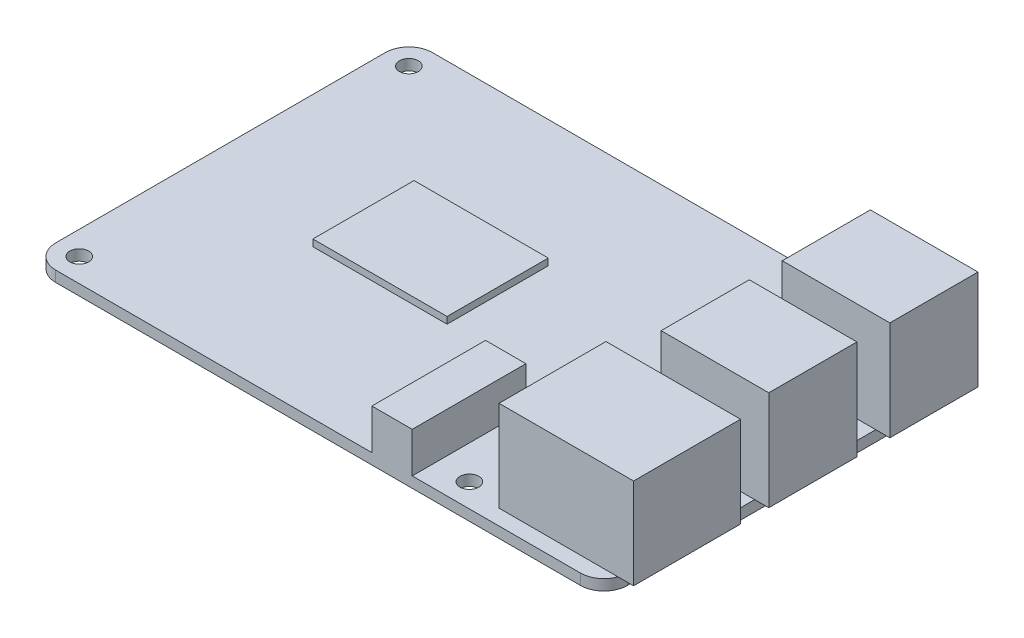
ISO-10303-21;
HEADER;
FILE_DESCRIPTION(('STEP AP214'),'2;1');
FILE_NAME('part.step','',(''),(''),'','','');
FILE_SCHEMA(('AUTOMOTIVE_DESIGN { 1 0 10303 214 1 1 1 1 }'));
ENDSEC;
DATA;
#1=APPLICATION_CONTEXT('core data for automotive mechanical design processes');
#2=APPLICATION_PROTOCOL_DEFINITION('international standard','automotive_design',2000,#1);
#3=PRODUCT_CONTEXT('',#1,'mechanical');
#4=PRODUCT('Part','Part','',(#3));
#5=PRODUCT_RELATED_PRODUCT_CATEGORY('part','',(#4));
#6=PRODUCT_DEFINITION_FORMATION('','',#4);
#7=PRODUCT_DEFINITION_CONTEXT('part definition',#1,'design');
#8=PRODUCT_DEFINITION('design','',#6,#7);
#9=PRODUCT_DEFINITION_SHAPE('','',#8);
#10=(LENGTH_UNIT() NAMED_UNIT(*) SI_UNIT(.MILLI.,.METRE.));
#11=(NAMED_UNIT(*) PLANE_ANGLE_UNIT() SI_UNIT($,.RADIAN.));
#12=(NAMED_UNIT(*) SI_UNIT($,.STERADIAN.) SOLID_ANGLE_UNIT());
#13=UNCERTAINTY_MEASURE_WITH_UNIT(LENGTH_MEASURE(1.E-05),#10,'distance_accuracy_value','');
#14=(GEOMETRIC_REPRESENTATION_CONTEXT(3) GLOBAL_UNCERTAINTY_ASSIGNED_CONTEXT((#13)) GLOBAL_UNIT_ASSIGNED_CONTEXT((#10,
#11,#12)) REPRESENTATION_CONTEXT('',''));
#15=CARTESIAN_POINT('',(0.,0.,0.));
#16=DIRECTION('',(0.,0.,1.));
#17=DIRECTION('',(1.,0.,0.));
#18=AXIS2_PLACEMENT_3D('',#15,#16,#17);
#19=CARTESIAN_POINT('',(39.,1.6,-24.5));
#20=DIRECTION('',(0.,-1.,0.));
#21=DIRECTION('',(0.,0.,-1.));
#22=AXIS2_PLACEMENT_3D('',#19,#20,#21);
#23=PLANE('',#22);
#24=DIRECTION('',(0.,0.,1.));
#25=VECTOR('',#24,1.);
#26=CARTESIAN_POINT('',(8.00000000000001,1.6,11.1));
#27=LINE('',#26,#25);
#28=CARTESIAN_POINT('',(8.00000000000001,1.6,11.1));
#29=VERTEX_POINT('',#28);
#30=CARTESIAN_POINT('',(8.00000000000001,1.6,28.));
#31=VERTEX_POINT('',#30);
#32=EDGE_CURVE('E259',#29,#31,#27,.T.);
#33=ORIENTED_EDGE('',*,*,#32,.F.);
#34=DIRECTION('',(-1.,0.,0.));
#35=VECTOR('',#34,1.);
#36=CARTESIAN_POINT('',(8.00000000000001,1.6,11.1));
#37=LINE('',#36,#35);
#38=CARTESIAN_POINT('',(14.,1.6,11.1));
#39=VERTEX_POINT('',#38);
#40=EDGE_CURVE('E272',#39,#29,#37,.T.);
#41=ORIENTED_EDGE('',*,*,#40,.F.);
#42=DIRECTION('',(0.,0.,-1.));
#43=VECTOR('',#42,1.);
#44=CARTESIAN_POINT('',(14.,1.6,11.1));
#45=LINE('',#44,#43);
#46=CARTESIAN_POINT('',(14.,1.6,28.));
#47=VERTEX_POINT('',#46);
#48=EDGE_CURVE('E262',#47,#39,#45,.T.);
#49=ORIENTED_EDGE('',*,*,#48,.F.);
#50=DIRECTION('',(1.,0.,0.));
#51=VECTOR('',#50,1.);
#52=CARTESIAN_POINT('',(-39.,1.6,28.));
#53=LINE('',#52,#51);
#54=CARTESIAN_POINT('',(39.,1.6,28.));
#55=VERTEX_POINT('',#54);
#56=EDGE_CURVE('E430',#47,#55,#53,.T.);
#57=ORIENTED_EDGE('',*,*,#56,.T.);
#58=CARTESIAN_POINT('',(39.,1.6,24.5));
#59=DIRECTION('',(0.,1.,0.));
#60=DIRECTION('',(0.,0.,-1.));
#61=AXIS2_PLACEMENT_3D('',#58,#59,#60);
#62=CIRCLE('',#61,3.5);
#63=CARTESIAN_POINT('',(42.2878564445547,1.6,25.7));
#64=VERTEX_POINT('',#63);
#65=EDGE_CURVE('E434',#55,#64,#62,.T.);
#66=ORIENTED_EDGE('',*,*,#65,.T.);
#67=DIRECTION('',(1.,0.,0.));
#68=VECTOR('',#67,1.);
#69=CARTESIAN_POINT('',(24.6,1.6,25.7));
#70=LINE('',#69,#68);
#71=CARTESIAN_POINT('',(24.6,1.6,25.7));
#72=VERTEX_POINT('',#71);
#73=EDGE_CURVE('E376',#72,#64,#70,.T.);
#74=ORIENTED_EDGE('',*,*,#73,.F.);
#75=DIRECTION('',(0.,0.,1.));
#76=VECTOR('',#75,1.);
#77=CARTESIAN_POINT('',(24.6,1.6,9.8));
#78=LINE('',#77,#76);
#79=CARTESIAN_POINT('',(24.6,1.6,9.8));
#80=VERTEX_POINT('',#79);
#81=EDGE_CURVE('E362',#80,#72,#78,.T.);
#82=ORIENTED_EDGE('',*,*,#81,.F.);
#83=DIRECTION('',(-1.,0.,0.));
#84=VECTOR('',#83,1.);
#85=CARTESIAN_POINT('',(24.6,1.6,9.8));
#86=LINE('',#85,#84);
#87=CARTESIAN_POINT('',(42.5,1.6,9.8));
#88=VERTEX_POINT('',#87);
#89=EDGE_CURVE('E11',#88,#80,#86,.T.);
#90=ORIENTED_EDGE('',*,*,#89,.F.);
#91=DIRECTION('',(0.,0.,-1.));
#92=VECTOR('',#91,1.);
#93=CARTESIAN_POINT('',(42.5,1.6,-24.5));
#94=LINE('',#93,#92);
#95=CARTESIAN_POINT('',(42.5,1.6,5.6));
#96=VERTEX_POINT('',#95);
#97=EDGE_CURVE('E441',#88,#96,#94,.T.);
#98=ORIENTED_EDGE('',*,*,#97,.T.);
#99=DIRECTION('',(1.,0.,0.));
#100=VECTOR('',#99,1.);
#101=CARTESIAN_POINT('',(28.6,1.6,5.6));
#102=LINE('',#101,#100);
#103=CARTESIAN_POINT('',(28.6,1.6,5.6));
#104=VERTEX_POINT('',#103);
#105=EDGE_CURVE('E343',#104,#96,#102,.T.);
#106=ORIENTED_EDGE('',*,*,#105,.F.);
#107=DIRECTION('',(0.,0.,1.));
#108=VECTOR('',#107,1.);
#109=CARTESIAN_POINT('',(28.6,1.6,-7.5));
#110=LINE('',#109,#108);
#111=CARTESIAN_POINT('',(28.6,1.6,-7.5));
#112=VERTEX_POINT('',#111);
#113=EDGE_CURVE('E328',#112,#104,#110,.T.);
#114=ORIENTED_EDGE('',*,*,#113,.F.);
#115=DIRECTION('',(-1.,0.,0.));
#116=VECTOR('',#115,1.);
#117=CARTESIAN_POINT('',(28.6,1.6,-7.5));
#118=LINE('',#117,#116);
#119=CARTESIAN_POINT('',(42.5,1.6,-7.5));
#120=VERTEX_POINT('',#119);
#121=EDGE_CURVE('E348',#120,#112,#118,.T.);
#122=ORIENTED_EDGE('',*,*,#121,.F.);
#123=CARTESIAN_POINT('',(42.5,1.6,-12.4));
#124=VERTEX_POINT('',#123);
#125=EDGE_CURVE('E527',#120,#124,#94,.T.);
#126=ORIENTED_EDGE('',*,*,#125,.T.);
#127=DIRECTION('',(1.,0.,0.));
#128=VECTOR('',#127,1.);
#129=CARTESIAN_POINT('',(28.6,1.6,-12.4));
#130=LINE('',#129,#128);
#131=CARTESIAN_POINT('',(28.6,1.6,-12.4));
#132=VERTEX_POINT('',#131);
#133=EDGE_CURVE('E309',#132,#124,#130,.T.);
#134=ORIENTED_EDGE('',*,*,#133,.F.);
#135=DIRECTION('',(0.,0.,1.));
#136=VECTOR('',#135,1.);
#137=CARTESIAN_POINT('',(28.6,1.6,-25.5));
#138=LINE('',#137,#136);
#139=CARTESIAN_POINT('',(28.6,1.6,-25.5));
#140=VERTEX_POINT('',#139);
#141=EDGE_CURVE('E294',#140,#132,#138,.T.);
#142=ORIENTED_EDGE('',*,*,#141,.F.);
#143=DIRECTION('',(-1.,0.,0.));
#144=VECTOR('',#143,1.);
#145=CARTESIAN_POINT('',(28.6,1.6,-25.5));
#146=LINE('',#145,#144);
#147=CARTESIAN_POINT('',(42.3541019662497,1.6,-25.5));
#148=VERTEX_POINT('',#147);
#149=EDGE_CURVE('E314',#148,#140,#146,.T.);
#150=ORIENTED_EDGE('',*,*,#149,.F.);
#151=CARTESIAN_POINT('',(39.,1.6,-24.5));
#152=DIRECTION('',(0.,1.,0.));
#153=DIRECTION('',(0.,0.,-1.));
#154=AXIS2_PLACEMENT_3D('',#151,#152,#153);
#155=CIRCLE('',#154,3.5);
#156=CARTESIAN_POINT('',(39.,1.6,-28.));
#157=VERTEX_POINT('',#156);
#158=EDGE_CURVE('E422',#148,#157,#155,.T.);
#159=ORIENTED_EDGE('',*,*,#158,.T.);
#160=DIRECTION('',(-1.,0.,0.));
#161=VECTOR('',#160,1.);
#162=CARTESIAN_POINT('',(-39.,1.6,-28.));
#163=LINE('',#162,#161);
#164=CARTESIAN_POINT('',(-39.,1.6,-28.));
#165=VERTEX_POINT('',#164);
#166=EDGE_CURVE('E421',#157,#165,#163,.T.);
#167=ORIENTED_EDGE('',*,*,#166,.T.);
#168=CARTESIAN_POINT('',(-39.,1.6,-24.5));
#169=DIRECTION('',(0.,1.,0.));
#170=DIRECTION('',(0.,0.,-1.));
#171=AXIS2_PLACEMENT_3D('',#168,#169,#170);
#172=CIRCLE('',#171,3.5);
#173=CARTESIAN_POINT('',(-42.5,1.6,-24.5));
#174=VERTEX_POINT('',#173);
#175=EDGE_CURVE('E424',#165,#174,#172,.T.);
#176=ORIENTED_EDGE('',*,*,#175,.T.);
#177=DIRECTION('',(0.,0.,1.));
#178=VECTOR('',#177,1.);
#179=CARTESIAN_POINT('',(-42.5,1.6,-24.5));
#180=LINE('',#179,#178);
#181=CARTESIAN_POINT('',(-42.5,1.6,24.5));
#182=VERTEX_POINT('',#181);
#183=EDGE_CURVE('E426',#174,#182,#180,.T.);
#184=ORIENTED_EDGE('',*,*,#183,.T.);
#185=CARTESIAN_POINT('',(-39.,1.6,24.5));
#186=DIRECTION('',(0.,1.,0.));
#187=DIRECTION('',(0.,0.,-1.));
#188=AXIS2_PLACEMENT_3D('',#185,#186,#187);
#189=CIRCLE('',#188,3.5);
#190=CARTESIAN_POINT('',(-39.,1.6,28.));
#191=VERTEX_POINT('',#190);
#192=EDGE_CURVE('E428',#182,#191,#189,.T.);
#193=ORIENTED_EDGE('',*,*,#192,.T.);
#194=EDGE_CURVE('E431',#191,#31,#53,.T.);
#195=ORIENTED_EDGE('',*,*,#194,.T.);
#196=EDGE_LOOP('',(#33,#41,#49,#57,#66,#74,#82,#90,#98,#106,#114,#122,#126,#134,#142,#150,#159,
#167,#176,#184,#193,#195));
#197=FACE_BOUND('',#196,.T.);
#198=CARTESIAN_POINT('',(-39.,1.6,24.5));
#199=DIRECTION('',(0.,1.,0.));
#200=DIRECTION('',(0.,0.,-1.));
#201=AXIS2_PLACEMENT_3D('',#198,#199,#200);
#202=CIRCLE('',#201,1.4);
#203=CARTESIAN_POINT('',(-39.,1.6,23.1));
#204=VERTEX_POINT('',#203);
#205=EDGE_CURVE('E394',#204,#204,#202,.T.);
#206=ORIENTED_EDGE('',*,*,#205,.F.);
#207=EDGE_LOOP('',(#206));
#208=FACE_BOUND('',#207,.T.);
#209=CARTESIAN_POINT('',(19.,1.6,-24.5));
#210=DIRECTION('',(0.,1.,0.));
#211=DIRECTION('',(0.,0.,1.));
#212=AXIS2_PLACEMENT_3D('',#209,#210,#211);
#213=CIRCLE('',#212,1.4);
#214=CARTESIAN_POINT('',(19.,1.6,-23.1));
#215=VERTEX_POINT('',#214);
#216=EDGE_CURVE('E406',#215,#215,#213,.T.);
#217=ORIENTED_EDGE('',*,*,#216,.F.);
#218=EDGE_LOOP('',(#217));
#219=FACE_BOUND('',#218,.T.);
#220=CARTESIAN_POINT('',(-39.,1.6,-24.5));
#221=DIRECTION('',(0.,1.,0.));
#222=DIRECTION('',(0.,0.,1.));
#223=AXIS2_PLACEMENT_3D('',#220,#221,#222);
#224=CIRCLE('',#223,1.4);
#225=CARTESIAN_POINT('',(-39.,1.6,-23.1));
#226=VERTEX_POINT('',#225);
#227=EDGE_CURVE('E412',#226,#226,#224,.T.);
#228=ORIENTED_EDGE('',*,*,#227,.F.);
#229=EDGE_LOOP('',(#228));
#230=FACE_BOUND('',#229,.T.);
#231=CARTESIAN_POINT('',(19.,1.6,24.5));
#232=DIRECTION('',(0.,1.,0.));
#233=DIRECTION('',(0.,0.,-1.));
#234=AXIS2_PLACEMENT_3D('',#231,#232,#233);
#235=CIRCLE('',#234,1.4);
#236=CARTESIAN_POINT('',(19.,1.6,23.1));
#237=VERTEX_POINT('',#236);
#238=EDGE_CURVE('E400',#237,#237,#235,.T.);
#239=ORIENTED_EDGE('',*,*,#238,.F.);
#240=EDGE_LOOP('',(#239));
#241=FACE_BOUND('',#240,.T.);
#242=DIRECTION('',(0.,0.,1.));
#243=VECTOR('',#242,1.);
#244=CARTESIAN_POINT('',(-22.8863754940238,1.6,-9.15515216544926));
#245=LINE('',#244,#243);
#246=CARTESIAN_POINT('',(-22.8863754940238,1.6,-9.15515216544926));
#247=VERTEX_POINT('',#246);
#248=CARTESIAN_POINT('',(-22.8863754940238,1.6,5.88180167054008));
#249=VERTEX_POINT('',#248);
#250=EDGE_CURVE('E258',#247,#249,#245,.T.);
#251=ORIENTED_EDGE('',*,*,#250,.F.);
#252=DIRECTION('',(-1.,0.,0.));
#253=VECTOR('',#252,1.);
#254=CARTESIAN_POINT('',(-22.8863754940238,1.6,-9.15515216544926));
#255=LINE('',#254,#253);
#256=CARTESIAN_POINT('',(-2.93939591567062,1.6,-9.15515216544926));
#257=VERTEX_POINT('',#256);
#258=EDGE_CURVE('E255',#257,#247,#255,.T.);
#259=ORIENTED_EDGE('',*,*,#258,.F.);
#260=DIRECTION('',(0.,0.,-1.));
#261=VECTOR('',#260,1.);
#262=CARTESIAN_POINT('',(-2.93939591567062,1.6,-9.15515216544926));
#263=LINE('',#262,#261);
#264=CARTESIAN_POINT('',(-2.93939591567062,1.6,5.88180167054008));
#265=VERTEX_POINT('',#264);
#266=EDGE_CURVE('E55',#265,#257,#263,.T.);
#267=ORIENTED_EDGE('',*,*,#266,.F.);
#268=DIRECTION('',(1.,0.,0.));
#269=VECTOR('',#268,1.);
#270=CARTESIAN_POINT('',(-22.8863754940238,1.6,5.88180167054009));
#271=LINE('',#270,#269);
#272=EDGE_CURVE('E50',#249,#265,#271,.T.);
#273=ORIENTED_EDGE('',*,*,#272,.F.);
#274=EDGE_LOOP('',(#251,#259,#267,#273));
#275=FACE_BOUND('',#274,.T.);
#276=ADVANCED_FACE('F33',(#197,#208,#219,#230,#241,#275),#23,.F.);
#277=CARTESIAN_POINT('',(39.,0.,-24.5));
#278=DIRECTION('',(0.,-1.,0.));
#279=DIRECTION('',(0.,0.,-1.));
#280=AXIS2_PLACEMENT_3D('',#277,#278,#279);
#281=PLANE('',#280);
#282=CARTESIAN_POINT('',(19.,0.,24.5));
#283=DIRECTION('',(0.,1.,0.));
#284=DIRECTION('',(0.,0.,-1.));
#285=AXIS2_PLACEMENT_3D('',#282,#283,#284);
#286=CIRCLE('',#285,1.4);
#287=CARTESIAN_POINT('',(19.,0.,23.1));
#288=VERTEX_POINT('',#287);
#289=EDGE_CURVE('E397',#288,#288,#286,.T.);
#290=ORIENTED_EDGE('',*,*,#289,.T.);
#291=EDGE_LOOP('',(#290));
#292=FACE_BOUND('',#291,.T.);
#293=CARTESIAN_POINT('',(-39.,0.,-24.5));
#294=DIRECTION('',(0.,1.,0.));
#295=DIRECTION('',(0.,0.,1.));
#296=AXIS2_PLACEMENT_3D('',#293,#294,#295);
#297=CIRCLE('',#296,1.4);
#298=CARTESIAN_POINT('',(-39.,0.,-23.1));
#299=VERTEX_POINT('',#298);
#300=EDGE_CURVE('E409',#299,#299,#297,.T.);
#301=ORIENTED_EDGE('',*,*,#300,.T.);
#302=EDGE_LOOP('',(#301));
#303=FACE_BOUND('',#302,.T.);
#304=CARTESIAN_POINT('',(39.,0.,-24.5));
#305=DIRECTION('',(0.,1.,0.));
#306=DIRECTION('',(0.,0.,-1.));
#307=AXIS2_PLACEMENT_3D('',#304,#305,#306);
#308=CIRCLE('',#307,3.5);
#309=CARTESIAN_POINT('',(42.5,0.,-24.5));
#310=VERTEX_POINT('',#309);
#311=CARTESIAN_POINT('',(39.,0.,-28.));
#312=VERTEX_POINT('',#311);
#313=EDGE_CURVE('E415',#310,#312,#308,.T.);
#314=ORIENTED_EDGE('',*,*,#313,.F.);
#315=DIRECTION('',(0.,0.,-1.));
#316=VECTOR('',#315,1.);
#317=CARTESIAN_POINT('',(42.5,0.,-24.5));
#318=LINE('',#317,#316);
#319=CARTESIAN_POINT('',(42.5,0.,24.5));
#320=VERTEX_POINT('',#319);
#321=EDGE_CURVE('E456',#320,#310,#318,.T.);
#322=ORIENTED_EDGE('',*,*,#321,.F.);
#323=CARTESIAN_POINT('',(39.,0.,24.5));
#324=DIRECTION('',(0.,1.,0.));
#325=DIRECTION('',(0.,0.,-1.));
#326=AXIS2_PLACEMENT_3D('',#323,#324,#325);
#327=CIRCLE('',#326,3.5);
#328=CARTESIAN_POINT('',(39.,0.,28.));
#329=VERTEX_POINT('',#328);
#330=EDGE_CURVE('E454',#329,#320,#327,.T.);
#331=ORIENTED_EDGE('',*,*,#330,.F.);
#332=DIRECTION('',(1.,0.,0.));
#333=VECTOR('',#332,1.);
#334=CARTESIAN_POINT('',(-39.,0.,28.));
#335=LINE('',#334,#333);
#336=CARTESIAN_POINT('',(-39.,0.,28.));
#337=VERTEX_POINT('',#336);
#338=EDGE_CURVE('E452',#337,#329,#335,.T.);
#339=ORIENTED_EDGE('',*,*,#338,.F.);
#340=CARTESIAN_POINT('',(-39.,0.,24.5));
#341=DIRECTION('',(0.,1.,0.));
#342=DIRECTION('',(0.,0.,-1.));
#343=AXIS2_PLACEMENT_3D('',#340,#341,#342);
#344=CIRCLE('',#343,3.5);
#345=CARTESIAN_POINT('',(-42.5,0.,24.5));
#346=VERTEX_POINT('',#345);
#347=EDGE_CURVE('E450',#346,#337,#344,.T.);
#348=ORIENTED_EDGE('',*,*,#347,.F.);
#349=DIRECTION('',(0.,0.,1.));
#350=VECTOR('',#349,1.);
#351=CARTESIAN_POINT('',(-42.5,0.,-24.5));
#352=LINE('',#351,#350);
#353=CARTESIAN_POINT('',(-42.5,0.,-24.5));
#354=VERTEX_POINT('',#353);
#355=EDGE_CURVE('E448',#354,#346,#352,.T.);
#356=ORIENTED_EDGE('',*,*,#355,.F.);
#357=CARTESIAN_POINT('',(-39.,0.,-24.5));
#358=DIRECTION('',(0.,1.,0.));
#359=DIRECTION('',(0.,0.,-1.));
#360=AXIS2_PLACEMENT_3D('',#357,#358,#359);
#361=CIRCLE('',#360,3.5);
#362=CARTESIAN_POINT('',(-39.,0.,-28.));
#363=VERTEX_POINT('',#362);
#364=EDGE_CURVE('E446',#363,#354,#361,.T.);
#365=ORIENTED_EDGE('',*,*,#364,.F.);
#366=DIRECTION('',(-1.,0.,0.));
#367=VECTOR('',#366,1.);
#368=CARTESIAN_POINT('',(-39.,0.,-28.));
#369=LINE('',#368,#367);
#370=EDGE_CURVE('E444',#312,#363,#369,.T.);
#371=ORIENTED_EDGE('',*,*,#370,.F.);
#372=EDGE_LOOP('',(#314,#322,#331,#339,#348,#356,#365,#371));
#373=FACE_BOUND('',#372,.T.);
#374=CARTESIAN_POINT('',(19.,0.,-24.5));
#375=DIRECTION('',(0.,1.,0.));
#376=DIRECTION('',(0.,0.,1.));
#377=AXIS2_PLACEMENT_3D('',#374,#375,#376);
#378=CIRCLE('',#377,1.4);
#379=CARTESIAN_POINT('',(19.,0.,-23.1));
#380=VERTEX_POINT('',#379);
#381=EDGE_CURVE('E403',#380,#380,#378,.T.);
#382=ORIENTED_EDGE('',*,*,#381,.T.);
#383=EDGE_LOOP('',(#382));
#384=FACE_BOUND('',#383,.T.);
#385=CARTESIAN_POINT('',(-39.,0.,24.5));
#386=DIRECTION('',(0.,1.,0.));
#387=DIRECTION('',(0.,0.,-1.));
#388=AXIS2_PLACEMENT_3D('',#385,#386,#387);
#389=CIRCLE('',#388,1.4);
#390=CARTESIAN_POINT('',(-39.,0.,23.1));
#391=VERTEX_POINT('',#390);
#392=EDGE_CURVE('E393',#391,#391,#389,.T.);
#393=ORIENTED_EDGE('',*,*,#392,.T.);
#394=EDGE_LOOP('',(#393));
#395=FACE_BOUND('',#394,.T.);
#396=ADVANCED_FACE('F491',(#292,#303,#373,#384,#395),#281,.T.);
#397=CARTESIAN_POINT('',(39.,1.6,-24.5));
#398=DIRECTION('',(0.,-1.,0.));
#399=DIRECTION('',(0.,0.,-1.));
#400=AXIS2_PLACEMENT_3D('',#397,#398,#399);
#401=CYLINDRICAL_SURFACE('',#400,3.5);
#402=ORIENTED_EDGE('',*,*,#313,.T.);
#403=DIRECTION('',(0.,-1.,0.));
#404=VECTOR('',#403,1.);
#405=CARTESIAN_POINT('',(39.,1.6,-28.));
#406=LINE('',#405,#404);
#407=EDGE_CURVE('E37',#157,#312,#406,.T.);
#408=ORIENTED_EDGE('',*,*,#407,.F.);
#409=ORIENTED_EDGE('',*,*,#158,.F.);
#410=CARTESIAN_POINT('',(42.5,1.6,-24.5));
#411=VERTEX_POINT('',#410);
#412=EDGE_CURVE('E418',#411,#148,#155,.T.);
#413=ORIENTED_EDGE('',*,*,#412,.F.);
#414=DIRECTION('',(0.,-1.,0.));
#415=VECTOR('',#414,1.);
#416=CARTESIAN_POINT('',(42.5,1.6,-24.5));
#417=LINE('',#416,#415);
#418=EDGE_CURVE('E440',#411,#310,#417,.T.);
#419=ORIENTED_EDGE('',*,*,#418,.T.);
#420=EDGE_LOOP('',(#402,#408,#409,#413,#419));
#421=FACE_BOUND('',#420,.T.);
#422=ADVANCED_FACE('F35',(#421),#401,.T.);
#423=CARTESIAN_POINT('',(-39.,1.6,-28.));
#424=DIRECTION('',(0.,0.,1.));
#425=DIRECTION('',(1.,0.,0.));
#426=AXIS2_PLACEMENT_3D('',#423,#424,#425);
#427=PLANE('',#426);
#428=ORIENTED_EDGE('',*,*,#370,.T.);
#429=DIRECTION('',(0.,-1.,0.));
#430=VECTOR('',#429,1.);
#431=CARTESIAN_POINT('',(-39.,1.6,-28.));
#432=LINE('',#431,#430);
#433=EDGE_CURVE('E474',#165,#363,#432,.T.);
#434=ORIENTED_EDGE('',*,*,#433,.F.);
#435=ORIENTED_EDGE('',*,*,#166,.F.);
#436=ORIENTED_EDGE('',*,*,#407,.T.);
#437=EDGE_LOOP('',(#428,#434,#435,#436));
#438=FACE_BOUND('',#437,.T.);
#439=ADVANCED_FACE('F484',(#438),#427,.F.);
#440=CARTESIAN_POINT('',(-39.,1.6,-24.5));
#441=DIRECTION('',(0.,-1.,0.));
#442=DIRECTION('',(0.,0.,-1.));
#443=AXIS2_PLACEMENT_3D('',#440,#441,#442);
#444=CYLINDRICAL_SURFACE('',#443,3.5);
#445=ORIENTED_EDGE('',*,*,#364,.T.);
#446=DIRECTION('',(0.,-1.,0.));
#447=VECTOR('',#446,1.);
#448=CARTESIAN_POINT('',(-42.5,1.6,-24.5));
#449=LINE('',#448,#447);
#450=EDGE_CURVE('E472',#174,#354,#449,.T.);
#451=ORIENTED_EDGE('',*,*,#450,.F.);
#452=ORIENTED_EDGE('',*,*,#175,.F.);
#453=ORIENTED_EDGE('',*,*,#433,.T.);
#454=EDGE_LOOP('',(#445,#451,#452,#453));
#455=FACE_BOUND('',#454,.T.);
#456=ADVANCED_FACE('F497',(#455),#444,.T.);
#457=CARTESIAN_POINT('',(-42.5,1.6,-24.5));
#458=DIRECTION('',(1.,0.,0.));
#459=DIRECTION('',(0.,0.,-1.));
#460=AXIS2_PLACEMENT_3D('',#457,#458,#459);
#461=PLANE('',#460);
#462=ORIENTED_EDGE('',*,*,#355,.T.);
#463=DIRECTION('',(0.,-1.,0.));
#464=VECTOR('',#463,1.);
#465=CARTESIAN_POINT('',(-42.5,1.6,24.5));
#466=LINE('',#465,#464);
#467=EDGE_CURVE('E469',#182,#346,#466,.T.);
#468=ORIENTED_EDGE('',*,*,#467,.F.);
#469=ORIENTED_EDGE('',*,*,#183,.F.);
#470=ORIENTED_EDGE('',*,*,#450,.T.);
#471=EDGE_LOOP('',(#462,#468,#469,#470));
#472=FACE_BOUND('',#471,.T.);
#473=ADVANCED_FACE('F500',(#472),#461,.F.);
#474=CARTESIAN_POINT('',(-39.,1.6,24.5));
#475=DIRECTION('',(0.,-1.,0.));
#476=DIRECTION('',(0.,0.,-1.));
#477=AXIS2_PLACEMENT_3D('',#474,#475,#476);
#478=CYLINDRICAL_SURFACE('',#477,3.5);
#479=ORIENTED_EDGE('',*,*,#347,.T.);
#480=DIRECTION('',(0.,-1.,0.));
#481=VECTOR('',#480,1.);
#482=CARTESIAN_POINT('',(-39.,1.6,28.));
#483=LINE('',#482,#481);
#484=EDGE_CURVE('E466',#191,#337,#483,.T.);
#485=ORIENTED_EDGE('',*,*,#484,.F.);
#486=ORIENTED_EDGE('',*,*,#192,.F.);
#487=ORIENTED_EDGE('',*,*,#467,.T.);
#488=EDGE_LOOP('',(#479,#485,#486,#487));
#489=FACE_BOUND('',#488,.T.);
#490=ADVANCED_FACE('F591',(#489),#478,.T.);
#491=CARTESIAN_POINT('',(-39.,1.6,28.));
#492=DIRECTION('',(0.,0.,-1.));
#493=DIRECTION('',(-1.,0.,0.));
#494=AXIS2_PLACEMENT_3D('',#491,#492,#493);
#495=PLANE('',#494);
#496=ORIENTED_EDGE('',*,*,#338,.T.);
#497=DIRECTION('',(0.,-1.,0.));
#498=VECTOR('',#497,1.);
#499=CARTESIAN_POINT('',(39.,1.6,28.));
#500=LINE('',#499,#498);
#501=EDGE_CURVE('E463',#55,#329,#500,.T.);
#502=ORIENTED_EDGE('',*,*,#501,.F.);
#503=ORIENTED_EDGE('',*,*,#56,.F.);
#504=DIRECTION('',(0.,-1.,0.));
#505=VECTOR('',#504,1.);
#506=CARTESIAN_POINT('',(14.,7.6,28.));
#507=LINE('',#506,#505);
#508=CARTESIAN_POINT('',(14.,7.6,28.));
#509=VERTEX_POINT('',#508);
#510=EDGE_CURVE('E288',#509,#47,#507,.T.);
#511=ORIENTED_EDGE('',*,*,#510,.F.);
#512=DIRECTION('',(1.,0.,0.));
#513=VECTOR('',#512,1.);
#514=CARTESIAN_POINT('',(8.00000000000001,7.6,28.));
#515=LINE('',#514,#513);
#516=CARTESIAN_POINT('',(8.00000000000001,7.6,28.));
#517=VERTEX_POINT('',#516);
#518=EDGE_CURVE('E271',#517,#509,#515,.T.);
#519=ORIENTED_EDGE('',*,*,#518,.F.);
#520=DIRECTION('',(0.,-1.,0.));
#521=VECTOR('',#520,1.);
#522=CARTESIAN_POINT('',(8.00000000000001,7.6,28.));
#523=LINE('',#522,#521);
#524=EDGE_CURVE('E291',#517,#31,#523,.T.);
#525=ORIENTED_EDGE('',*,*,#524,.T.);
#526=ORIENTED_EDGE('',*,*,#194,.F.);
#527=ORIENTED_EDGE('',*,*,#484,.T.);
#528=EDGE_LOOP('',(#496,#502,#503,#511,#519,#525,#526,#527));
#529=FACE_BOUND('',#528,.T.);
#530=ADVANCED_FACE('F587',(#529),#495,.F.);
#531=CARTESIAN_POINT('',(39.,1.6,24.5));
#532=DIRECTION('',(0.,-1.,0.));
#533=DIRECTION('',(0.,0.,-1.));
#534=AXIS2_PLACEMENT_3D('',#531,#532,#533);
#535=CYLINDRICAL_SURFACE('',#534,3.5);
#536=ORIENTED_EDGE('',*,*,#330,.T.);
#537=DIRECTION('',(0.,-1.,0.));
#538=VECTOR('',#537,1.);
#539=CARTESIAN_POINT('',(42.5,1.6,24.5));
#540=LINE('',#539,#538);
#541=CARTESIAN_POINT('',(42.5,1.6,24.5));
#542=VERTEX_POINT('',#541);
#543=EDGE_CURVE('E460',#542,#320,#540,.T.);
#544=ORIENTED_EDGE('',*,*,#543,.F.);
#545=EDGE_CURVE('E433',#64,#542,#62,.T.);
#546=ORIENTED_EDGE('',*,*,#545,.F.);
#547=ORIENTED_EDGE('',*,*,#65,.F.);
#548=ORIENTED_EDGE('',*,*,#501,.T.);
#549=EDGE_LOOP('',(#536,#544,#546,#547,#548));
#550=FACE_BOUND('',#549,.T.);
#551=ADVANCED_FACE('F584',(#550),#535,.T.);
#552=CARTESIAN_POINT('',(42.5,1.6,-24.5));
#553=DIRECTION('',(-1.,0.,0.));
#554=DIRECTION('',(0.,0.,1.));
#555=AXIS2_PLACEMENT_3D('',#552,#553,#554);
#556=PLANE('',#555);
#557=ORIENTED_EDGE('',*,*,#321,.T.);
#558=ORIENTED_EDGE('',*,*,#418,.F.);
#559=EDGE_CURVE('E436',#124,#411,#94,.T.);
#560=ORIENTED_EDGE('',*,*,#559,.F.);
#561=ORIENTED_EDGE('',*,*,#125,.F.);
#562=EDGE_CURVE('E531',#96,#120,#94,.T.);
#563=ORIENTED_EDGE('',*,*,#562,.F.);
#564=ORIENTED_EDGE('',*,*,#97,.F.);
#565=EDGE_CURVE('E437',#542,#88,#94,.T.);
#566=ORIENTED_EDGE('',*,*,#565,.F.);
#567=ORIENTED_EDGE('',*,*,#543,.T.);
#568=EDGE_LOOP('',(#557,#558,#560,#561,#563,#564,#566,#567));
#569=FACE_BOUND('',#568,.T.);
#570=ADVANCED_FACE('F581',(#569),#556,.F.);
#571=CARTESIAN_POINT('',(-39.,1.6,-24.5));
#572=DIRECTION('',(0.,-1.,0.));
#573=DIRECTION('',(0.,0.,-1.));
#574=AXIS2_PLACEMENT_3D('',#571,#572,#573);
#575=CYLINDRICAL_SURFACE('',#574,1.4);
#576=ORIENTED_EDGE('',*,*,#227,.T.);
#577=EDGE_LOOP('',(#576));
#578=FACE_BOUND('',#577,.T.);
#579=ORIENTED_EDGE('',*,*,#300,.F.);
#580=EDGE_LOOP('',(#579));
#581=FACE_BOUND('',#580,.T.);
#582=ADVANCED_FACE('F578',(#578,#581),#575,.F.);
#583=CARTESIAN_POINT('',(19.,1.6,-24.5));
#584=DIRECTION('',(0.,-1.,0.));
#585=DIRECTION('',(0.,0.,-1.));
#586=AXIS2_PLACEMENT_3D('',#583,#584,#585);
#587=CYLINDRICAL_SURFACE('',#586,1.4);
#588=ORIENTED_EDGE('',*,*,#216,.T.);
#589=EDGE_LOOP('',(#588));
#590=FACE_BOUND('',#589,.T.);
#591=ORIENTED_EDGE('',*,*,#381,.F.);
#592=EDGE_LOOP('',(#591));
#593=FACE_BOUND('',#592,.T.);
#594=ADVANCED_FACE('F866',(#590,#593),#587,.F.);
#595=CARTESIAN_POINT('',(19.,1.6,24.5));
#596=DIRECTION('',(0.,-1.,0.));
#597=DIRECTION('',(0.,0.,-1.));
#598=AXIS2_PLACEMENT_3D('',#595,#596,#597);
#599=CYLINDRICAL_SURFACE('',#598,1.4);
#600=ORIENTED_EDGE('',*,*,#238,.T.);
#601=EDGE_LOOP('',(#600));
#602=FACE_BOUND('',#601,.T.);
#603=ORIENTED_EDGE('',*,*,#289,.F.);
#604=EDGE_LOOP('',(#603));
#605=FACE_BOUND('',#604,.T.);
#606=ADVANCED_FACE('F863',(#602,#605),#599,.F.);
#607=CARTESIAN_POINT('',(-39.,1.6,24.5));
#608=DIRECTION('',(0.,-1.,0.));
#609=DIRECTION('',(0.,0.,-1.));
#610=AXIS2_PLACEMENT_3D('',#607,#608,#609);
#611=CYLINDRICAL_SURFACE('',#610,1.4);
#612=ORIENTED_EDGE('',*,*,#205,.T.);
#613=EDGE_LOOP('',(#612));
#614=FACE_BOUND('',#613,.T.);
#615=ORIENTED_EDGE('',*,*,#392,.F.);
#616=EDGE_LOOP('',(#615));
#617=FACE_BOUND('',#616,.T.);
#618=ADVANCED_FACE('F861',(#614,#617),#611,.F.);
#619=CARTESIAN_POINT('',(0.,1.6,0.));
#620=DIRECTION('',(0.,1.,0.));
#621=DIRECTION('',(0.,0.,1.));
#622=AXIS2_PLACEMENT_3D('',#619,#620,#621);
#623=PLANE('',#622);
#624=CARTESIAN_POINT('',(44.6,1.6,25.7));
#625=VERTEX_POINT('',#624);
#626=EDGE_CURVE('E375',#64,#625,#70,.T.);
#627=ORIENTED_EDGE('',*,*,#626,.F.);
#628=ORIENTED_EDGE('',*,*,#545,.T.);
#629=ORIENTED_EDGE('',*,*,#565,.T.);
#630=CARTESIAN_POINT('',(44.6,1.6,9.8));
#631=VERTEX_POINT('',#630);
#632=EDGE_CURVE('E43',#631,#88,#86,.T.);
#633=ORIENTED_EDGE('',*,*,#632,.F.);
#634=DIRECTION('',(0.,0.,-1.));
#635=VECTOR('',#634,1.);
#636=CARTESIAN_POINT('',(44.6,1.6,9.8));
#637=LINE('',#636,#635);
#638=EDGE_CURVE('E379',#625,#631,#637,.T.);
#639=ORIENTED_EDGE('',*,*,#638,.F.);
#640=EDGE_LOOP('',(#627,#628,#629,#633,#639));
#641=FACE_BOUND('',#640,.T.);
#642=ADVANCED_FACE('F831',(#641),#623,.F.);
#643=CARTESIAN_POINT('',(24.6,15.1,9.8));
#644=DIRECTION('',(1.,0.,0.));
#645=DIRECTION('',(0.,0.,-1.));
#646=AXIS2_PLACEMENT_3D('',#643,#644,#645);
#647=PLANE('',#646);
#648=ORIENTED_EDGE('',*,*,#81,.T.);
#649=DIRECTION('',(0.,-1.,0.));
#650=VECTOR('',#649,1.);
#651=CARTESIAN_POINT('',(24.6,15.1,25.7));
#652=LINE('',#651,#650);
#653=CARTESIAN_POINT('',(24.6,15.1,25.7));
#654=VERTEX_POINT('',#653);
#655=EDGE_CURVE('E390',#654,#72,#652,.T.);
#656=ORIENTED_EDGE('',*,*,#655,.F.);
#657=DIRECTION('',(0.,0.,1.));
#658=VECTOR('',#657,1.);
#659=CARTESIAN_POINT('',(24.6,15.1,9.8));
#660=LINE('',#659,#658);
#661=CARTESIAN_POINT('',(24.6,15.1,9.8));
#662=VERTEX_POINT('',#661);
#663=EDGE_CURVE('E363',#662,#654,#660,.T.);
#664=ORIENTED_EDGE('',*,*,#663,.F.);
#665=DIRECTION('',(0.,-1.,0.));
#666=VECTOR('',#665,1.);
#667=CARTESIAN_POINT('',(24.6,15.1,9.8));
#668=LINE('',#667,#666);
#669=EDGE_CURVE('E372',#662,#80,#668,.T.);
#670=ORIENTED_EDGE('',*,*,#669,.T.);
#671=EDGE_LOOP('',(#648,#656,#664,#670));
#672=FACE_BOUND('',#671,.T.);
#673=ADVANCED_FACE('F843',(#672),#647,.F.);
#674=CARTESIAN_POINT('',(24.6,15.1,25.7));
#675=DIRECTION('',(0.,0.,-1.));
#676=DIRECTION('',(-1.,0.,0.));
#677=AXIS2_PLACEMENT_3D('',#674,#675,#676);
#678=PLANE('',#677);
#679=ORIENTED_EDGE('',*,*,#73,.T.);
#680=ORIENTED_EDGE('',*,*,#626,.T.);
#681=DIRECTION('',(0.,-1.,0.));
#682=VECTOR('',#681,1.);
#683=CARTESIAN_POINT('',(44.6,15.1,25.7));
#684=LINE('',#683,#682);
#685=CARTESIAN_POINT('',(44.6,15.1,25.7));
#686=VERTEX_POINT('',#685);
#687=EDGE_CURVE('E387',#686,#625,#684,.T.);
#688=ORIENTED_EDGE('',*,*,#687,.F.);
#689=DIRECTION('',(1.,0.,0.));
#690=VECTOR('',#689,1.);
#691=CARTESIAN_POINT('',(24.6,15.1,25.7));
#692=LINE('',#691,#690);
#693=EDGE_CURVE('E366',#654,#686,#692,.T.);
#694=ORIENTED_EDGE('',*,*,#693,.F.);
#695=ORIENTED_EDGE('',*,*,#655,.T.);
#696=EDGE_LOOP('',(#679,#680,#688,#694,#695));
#697=FACE_BOUND('',#696,.T.);
#698=ADVANCED_FACE('F835',(#697),#678,.F.);
#699=CARTESIAN_POINT('',(44.6,15.1,9.8));
#700=DIRECTION('',(-1.,0.,0.));
#701=DIRECTION('',(0.,0.,1.));
#702=AXIS2_PLACEMENT_3D('',#699,#700,#701);
#703=PLANE('',#702);
#704=ORIENTED_EDGE('',*,*,#638,.T.);
#705=DIRECTION('',(0.,-1.,0.));
#706=VECTOR('',#705,1.);
#707=CARTESIAN_POINT('',(44.6,15.1,9.8));
#708=LINE('',#707,#706);
#709=CARTESIAN_POINT('',(44.6,15.1,9.8));
#710=VERTEX_POINT('',#709);
#711=EDGE_CURVE('E384',#710,#631,#708,.T.);
#712=ORIENTED_EDGE('',*,*,#711,.F.);
#713=DIRECTION('',(0.,0.,-1.));
#714=VECTOR('',#713,1.);
#715=CARTESIAN_POINT('',(44.6,15.1,9.8));
#716=LINE('',#715,#714);
#717=EDGE_CURVE('E368',#686,#710,#716,.T.);
#718=ORIENTED_EDGE('',*,*,#717,.F.);
#719=ORIENTED_EDGE('',*,*,#687,.T.);
#720=EDGE_LOOP('',(#704,#712,#718,#719));
#721=FACE_BOUND('',#720,.T.);
#722=ADVANCED_FACE('F848',(#721),#703,.F.);
#723=CARTESIAN_POINT('',(24.6,15.1,9.8));
#724=DIRECTION('',(0.,0.,1.));
#725=DIRECTION('',(1.,0.,0.));
#726=AXIS2_PLACEMENT_3D('',#723,#724,#725);
#727=PLANE('',#726);
#728=ORIENTED_EDGE('',*,*,#632,.T.);
#729=ORIENTED_EDGE('',*,*,#89,.T.);
#730=ORIENTED_EDGE('',*,*,#669,.F.);
#731=DIRECTION('',(-1.,0.,0.));
#732=VECTOR('',#731,1.);
#733=CARTESIAN_POINT('',(24.6,15.1,9.8));
#734=LINE('',#733,#732);
#735=EDGE_CURVE('E370',#710,#662,#734,.T.);
#736=ORIENTED_EDGE('',*,*,#735,.F.);
#737=ORIENTED_EDGE('',*,*,#711,.T.);
#738=EDGE_LOOP('',(#728,#729,#730,#736,#737));
#739=FACE_BOUND('',#738,.T.);
#740=ADVANCED_FACE('F840',(#739),#727,.F.);
#741=CARTESIAN_POINT('',(0.,15.1,0.));
#742=DIRECTION('',(0.,1.,0.));
#743=DIRECTION('',(0.,0.,1.));
#744=AXIS2_PLACEMENT_3D('',#741,#742,#743);
#745=PLANE('',#744);
#746=ORIENTED_EDGE('',*,*,#663,.T.);
#747=ORIENTED_EDGE('',*,*,#693,.T.);
#748=ORIENTED_EDGE('',*,*,#717,.T.);
#749=ORIENTED_EDGE('',*,*,#735,.T.);
#750=EDGE_LOOP('',(#746,#747,#748,#749));
#751=FACE_BOUND('',#750,.T.);
#752=ADVANCED_FACE('F608',(#751),#745,.T.);
#753=CARTESIAN_POINT('',(0.,1.6,0.));
#754=DIRECTION('',(0.,1.,0.));
#755=DIRECTION('',(0.,0.,1.));
#756=AXIS2_PLACEMENT_3D('',#753,#754,#755);
#757=PLANE('',#756);
#758=CARTESIAN_POINT('',(44.6,1.6,5.6));
#759=VERTEX_POINT('',#758);
#760=EDGE_CURVE('E342',#96,#759,#102,.T.);
#761=ORIENTED_EDGE('',*,*,#760,.F.);
#762=ORIENTED_EDGE('',*,*,#562,.T.);
#763=CARTESIAN_POINT('',(44.6,1.6,-7.5));
#764=VERTEX_POINT('',#763);
#765=EDGE_CURVE('E333',#764,#120,#118,.T.);
#766=ORIENTED_EDGE('',*,*,#765,.F.);
#767=DIRECTION('',(0.,0.,-1.));
#768=VECTOR('',#767,1.);
#769=CARTESIAN_POINT('',(44.6,1.6,-7.5));
#770=LINE('',#769,#768);
#771=EDGE_CURVE('E346',#759,#764,#770,.T.);
#772=ORIENTED_EDGE('',*,*,#771,.F.);
#773=EDGE_LOOP('',(#761,#762,#766,#772));
#774=FACE_BOUND('',#773,.T.);
#775=ADVANCED_FACE('F539',(#774),#757,.F.);
#776=CARTESIAN_POINT('',(28.6,16.4,-7.5));
#777=DIRECTION('',(1.,0.,0.));
#778=DIRECTION('',(0.,0.,-1.));
#779=AXIS2_PLACEMENT_3D('',#776,#777,#778);
#780=PLANE('',#779);
#781=ORIENTED_EDGE('',*,*,#113,.T.);
#782=DIRECTION('',(0.,-1.,0.));
#783=VECTOR('',#782,1.);
#784=CARTESIAN_POINT('',(28.6,16.4,5.6));
#785=LINE('',#784,#783);
#786=CARTESIAN_POINT('',(28.6,16.4,5.6));
#787=VERTEX_POINT('',#786);
#788=EDGE_CURVE('E359',#787,#104,#785,.T.);
#789=ORIENTED_EDGE('',*,*,#788,.F.);
#790=DIRECTION('',(0.,0.,1.));
#791=VECTOR('',#790,1.);
#792=CARTESIAN_POINT('',(28.6,16.4,-7.5));
#793=LINE('',#792,#791);
#794=CARTESIAN_POINT('',(28.6,16.4,-7.5));
#795=VERTEX_POINT('',#794);
#796=EDGE_CURVE('E329',#795,#787,#793,.T.);
#797=ORIENTED_EDGE('',*,*,#796,.F.);
#798=DIRECTION('',(0.,-1.,0.));
#799=VECTOR('',#798,1.);
#800=CARTESIAN_POINT('',(28.6,16.4,-7.5));
#801=LINE('',#800,#799);
#802=EDGE_CURVE('E339',#795,#112,#801,.T.);
#803=ORIENTED_EDGE('',*,*,#802,.T.);
#804=EDGE_LOOP('',(#781,#789,#797,#803));
#805=FACE_BOUND('',#804,.T.);
#806=ADVANCED_FACE('F546',(#805),#780,.F.);
#807=CARTESIAN_POINT('',(28.6,16.4,5.6));
#808=DIRECTION('',(0.,0.,-1.));
#809=DIRECTION('',(-1.,0.,0.));
#810=AXIS2_PLACEMENT_3D('',#807,#808,#809);
#811=PLANE('',#810);
#812=ORIENTED_EDGE('',*,*,#105,.T.);
#813=ORIENTED_EDGE('',*,*,#760,.T.);
#814=DIRECTION('',(0.,-1.,0.));
#815=VECTOR('',#814,1.);
#816=CARTESIAN_POINT('',(44.6,16.4,5.6));
#817=LINE('',#816,#815);
#818=CARTESIAN_POINT('',(44.6,16.4,5.6));
#819=VERTEX_POINT('',#818);
#820=EDGE_CURVE('E356',#819,#759,#817,.T.);
#821=ORIENTED_EDGE('',*,*,#820,.F.);
#822=DIRECTION('',(1.,0.,0.));
#823=VECTOR('',#822,1.);
#824=CARTESIAN_POINT('',(28.6,16.4,5.6));
#825=LINE('',#824,#823);
#826=EDGE_CURVE('E332',#787,#819,#825,.T.);
#827=ORIENTED_EDGE('',*,*,#826,.F.);
#828=ORIENTED_EDGE('',*,*,#788,.T.);
#829=EDGE_LOOP('',(#812,#813,#821,#827,#828));
#830=FACE_BOUND('',#829,.T.);
#831=ADVANCED_FACE('F542',(#830),#811,.F.);
#832=CARTESIAN_POINT('',(44.6,16.4,-7.5));
#833=DIRECTION('',(-1.,0.,0.));
#834=DIRECTION('',(0.,0.,1.));
#835=AXIS2_PLACEMENT_3D('',#832,#833,#834);
#836=PLANE('',#835);
#837=ORIENTED_EDGE('',*,*,#771,.T.);
#838=DIRECTION('',(0.,-1.,0.));
#839=VECTOR('',#838,1.);
#840=CARTESIAN_POINT('',(44.6,16.4,-7.5));
#841=LINE('',#840,#839);
#842=CARTESIAN_POINT('',(44.6,16.4,-7.5));
#843=VERTEX_POINT('',#842);
#844=EDGE_CURVE('E353',#843,#764,#841,.T.);
#845=ORIENTED_EDGE('',*,*,#844,.F.);
#846=DIRECTION('',(0.,0.,-1.));
#847=VECTOR('',#846,1.);
#848=CARTESIAN_POINT('',(44.6,16.4,-7.5));
#849=LINE('',#848,#847);
#850=EDGE_CURVE('E335',#819,#843,#849,.T.);
#851=ORIENTED_EDGE('',*,*,#850,.F.);
#852=ORIENTED_EDGE('',*,*,#820,.T.);
#853=EDGE_LOOP('',(#837,#845,#851,#852));
#854=FACE_BOUND('',#853,.T.);
#855=ADVANCED_FACE('F554',(#854),#836,.F.);
#856=CARTESIAN_POINT('',(28.6,16.4,-7.5));
#857=DIRECTION('',(0.,0.,1.));
#858=DIRECTION('',(1.,0.,0.));
#859=AXIS2_PLACEMENT_3D('',#856,#857,#858);
#860=PLANE('',#859);
#861=ORIENTED_EDGE('',*,*,#765,.T.);
#862=ORIENTED_EDGE('',*,*,#121,.T.);
#863=ORIENTED_EDGE('',*,*,#802,.F.);
#864=DIRECTION('',(-1.,0.,0.));
#865=VECTOR('',#864,1.);
#866=CARTESIAN_POINT('',(28.6,16.4,-7.5));
#867=LINE('',#866,#865);
#868=EDGE_CURVE('E337',#843,#795,#867,.T.);
#869=ORIENTED_EDGE('',*,*,#868,.F.);
#870=ORIENTED_EDGE('',*,*,#844,.T.);
#871=EDGE_LOOP('',(#861,#862,#863,#869,#870));
#872=FACE_BOUND('',#871,.T.);
#873=ADVANCED_FACE('F549',(#872),#860,.F.);
#874=CARTESIAN_POINT('',(0.,16.4,0.));
#875=DIRECTION('',(0.,1.,0.));
#876=DIRECTION('',(0.,0.,1.));
#877=AXIS2_PLACEMENT_3D('',#874,#875,#876);
#878=PLANE('',#877);
#879=ORIENTED_EDGE('',*,*,#796,.T.);
#880=ORIENTED_EDGE('',*,*,#826,.T.);
#881=ORIENTED_EDGE('',*,*,#850,.T.);
#882=ORIENTED_EDGE('',*,*,#868,.T.);
#883=EDGE_LOOP('',(#879,#880,#881,#882));
#884=FACE_BOUND('',#883,.T.);
#885=ADVANCED_FACE('F556',(#884),#878,.T.);
#886=CARTESIAN_POINT('',(0.,1.6,0.));
#887=DIRECTION('',(0.,1.,0.));
#888=DIRECTION('',(0.,0.,1.));
#889=AXIS2_PLACEMENT_3D('',#886,#887,#888);
#890=PLANE('',#889);
#891=ORIENTED_EDGE('',*,*,#559,.T.);
#892=ORIENTED_EDGE('',*,*,#412,.T.);
#893=CARTESIAN_POINT('',(44.6,1.6,-25.5));
#894=VERTEX_POINT('',#893);
#895=EDGE_CURVE('E299',#894,#148,#146,.T.);
#896=ORIENTED_EDGE('',*,*,#895,.F.);
#897=DIRECTION('',(0.,0.,-1.));
#898=VECTOR('',#897,1.);
#899=CARTESIAN_POINT('',(44.6,1.6,-25.5));
#900=LINE('',#899,#898);
#901=CARTESIAN_POINT('',(44.6,1.6,-12.4));
#902=VERTEX_POINT('',#901);
#903=EDGE_CURVE('E312',#902,#894,#900,.T.);
#904=ORIENTED_EDGE('',*,*,#903,.F.);
#905=EDGE_CURVE('E308',#124,#902,#130,.T.);
#906=ORIENTED_EDGE('',*,*,#905,.F.);
#907=EDGE_LOOP('',(#891,#892,#896,#904,#906));
#908=FACE_BOUND('',#907,.T.);
#909=ADVANCED_FACE('F510',(#908),#890,.F.);
#910=CARTESIAN_POINT('',(28.6,16.4,-25.5));
#911=DIRECTION('',(1.,0.,0.));
#912=DIRECTION('',(0.,0.,-1.));
#913=AXIS2_PLACEMENT_3D('',#910,#911,#912);
#914=PLANE('',#913);
#915=ORIENTED_EDGE('',*,*,#141,.T.);
#916=DIRECTION('',(0.,-1.,0.));
#917=VECTOR('',#916,1.);
#918=CARTESIAN_POINT('',(28.6,16.4,-12.4));
#919=LINE('',#918,#917);
#920=CARTESIAN_POINT('',(28.6,16.4,-12.4));
#921=VERTEX_POINT('',#920);
#922=EDGE_CURVE('E325',#921,#132,#919,.T.);
#923=ORIENTED_EDGE('',*,*,#922,.F.);
#924=DIRECTION('',(0.,0.,1.));
#925=VECTOR('',#924,1.);
#926=CARTESIAN_POINT('',(28.6,16.4,-25.5));
#927=LINE('',#926,#925);
#928=CARTESIAN_POINT('',(28.6,16.4,-25.5));
#929=VERTEX_POINT('',#928);
#930=EDGE_CURVE('E295',#929,#921,#927,.T.);
#931=ORIENTED_EDGE('',*,*,#930,.F.);
#932=DIRECTION('',(0.,-1.,0.));
#933=VECTOR('',#932,1.);
#934=CARTESIAN_POINT('',(28.6,16.4,-25.5));
#935=LINE('',#934,#933);
#936=EDGE_CURVE('E305',#929,#140,#935,.T.);
#937=ORIENTED_EDGE('',*,*,#936,.T.);
#938=EDGE_LOOP('',(#915,#923,#931,#937));
#939=FACE_BOUND('',#938,.T.);
#940=ADVANCED_FACE('F563',(#939),#914,.F.);
#941=CARTESIAN_POINT('',(28.6,16.4,-12.4));
#942=DIRECTION('',(0.,0.,-1.));
#943=DIRECTION('',(-1.,0.,0.));
#944=AXIS2_PLACEMENT_3D('',#941,#942,#943);
#945=PLANE('',#944);
#946=ORIENTED_EDGE('',*,*,#133,.T.);
#947=ORIENTED_EDGE('',*,*,#905,.T.);
#948=DIRECTION('',(0.,-1.,0.));
#949=VECTOR('',#948,1.);
#950=CARTESIAN_POINT('',(44.6,16.4,-12.4));
#951=LINE('',#950,#949);
#952=CARTESIAN_POINT('',(44.6,16.4,-12.4));
#953=VERTEX_POINT('',#952);
#954=EDGE_CURVE('E322',#953,#902,#951,.T.);
#955=ORIENTED_EDGE('',*,*,#954,.F.);
#956=DIRECTION('',(1.,0.,0.));
#957=VECTOR('',#956,1.);
#958=CARTESIAN_POINT('',(28.6,16.4,-12.4));
#959=LINE('',#958,#957);
#960=EDGE_CURVE('E298',#921,#953,#959,.T.);
#961=ORIENTED_EDGE('',*,*,#960,.F.);
#962=ORIENTED_EDGE('',*,*,#922,.T.);
#963=EDGE_LOOP('',(#946,#947,#955,#961,#962));
#964=FACE_BOUND('',#963,.T.);
#965=ADVANCED_FACE('F523',(#964),#945,.F.);
#966=CARTESIAN_POINT('',(44.6,16.4,-25.5));
#967=DIRECTION('',(-1.,0.,0.));
#968=DIRECTION('',(0.,0.,1.));
#969=AXIS2_PLACEMENT_3D('',#966,#967,#968);
#970=PLANE('',#969);
#971=ORIENTED_EDGE('',*,*,#903,.T.);
#972=DIRECTION('',(0.,-1.,0.));
#973=VECTOR('',#972,1.);
#974=CARTESIAN_POINT('',(44.6,16.4,-25.5));
#975=LINE('',#974,#973);
#976=CARTESIAN_POINT('',(44.6,16.4,-25.5));
#977=VERTEX_POINT('',#976);
#978=EDGE_CURVE('E319',#977,#894,#975,.T.);
#979=ORIENTED_EDGE('',*,*,#978,.F.);
#980=DIRECTION('',(0.,0.,-1.));
#981=VECTOR('',#980,1.);
#982=CARTESIAN_POINT('',(44.6,16.4,-25.5));
#983=LINE('',#982,#981);
#984=EDGE_CURVE('E301',#953,#977,#983,.T.);
#985=ORIENTED_EDGE('',*,*,#984,.F.);
#986=ORIENTED_EDGE('',*,*,#954,.T.);
#987=EDGE_LOOP('',(#971,#979,#985,#986));
#988=FACE_BOUND('',#987,.T.);
#989=ADVANCED_FACE('F520',(#988),#970,.F.);
#990=CARTESIAN_POINT('',(28.6,16.4,-25.5));
#991=DIRECTION('',(0.,0.,1.));
#992=DIRECTION('',(1.,0.,0.));
#993=AXIS2_PLACEMENT_3D('',#990,#991,#992);
#994=PLANE('',#993);
#995=ORIENTED_EDGE('',*,*,#895,.T.);
#996=ORIENTED_EDGE('',*,*,#149,.T.);
#997=ORIENTED_EDGE('',*,*,#936,.F.);
#998=DIRECTION('',(-1.,0.,0.));
#999=VECTOR('',#998,1.);
#1000=CARTESIAN_POINT('',(28.6,16.4,-25.5));
#1001=LINE('',#1000,#999);
#1002=EDGE_CURVE('E303',#977,#929,#1001,.T.);
#1003=ORIENTED_EDGE('',*,*,#1002,.F.);
#1004=ORIENTED_EDGE('',*,*,#978,.T.);
#1005=EDGE_LOOP('',(#995,#996,#997,#1003,#1004));
#1006=FACE_BOUND('',#1005,.T.);
#1007=ADVANCED_FACE('F514',(#1006),#994,.F.);
#1008=CARTESIAN_POINT('',(0.,16.4,0.));
#1009=DIRECTION('',(0.,1.,0.));
#1010=DIRECTION('',(0.,0.,1.));
#1011=AXIS2_PLACEMENT_3D('',#1008,#1009,#1010);
#1012=PLANE('',#1011);
#1013=ORIENTED_EDGE('',*,*,#930,.T.);
#1014=ORIENTED_EDGE('',*,*,#960,.T.);
#1015=ORIENTED_EDGE('',*,*,#984,.T.);
#1016=ORIENTED_EDGE('',*,*,#1002,.T.);
#1017=EDGE_LOOP('',(#1013,#1014,#1015,#1016));
#1018=FACE_BOUND('',#1017,.T.);
#1019=ADVANCED_FACE('F695',(#1018),#1012,.T.);
#1020=CARTESIAN_POINT('',(8.00000000000001,7.6,11.1));
#1021=DIRECTION('',(1.,0.,0.));
#1022=DIRECTION('',(0.,0.,-1.));
#1023=AXIS2_PLACEMENT_3D('',#1020,#1021,#1022);
#1024=PLANE('',#1023);
#1025=ORIENTED_EDGE('',*,*,#32,.T.);
#1026=ORIENTED_EDGE('',*,*,#524,.F.);
#1027=DIRECTION('',(0.,0.,1.));
#1028=VECTOR('',#1027,1.);
#1029=CARTESIAN_POINT('',(8.00000000000001,7.6,11.1));
#1030=LINE('',#1029,#1028);
#1031=CARTESIAN_POINT('',(8.00000000000001,7.6,11.1));
#1032=VERTEX_POINT('',#1031);
#1033=EDGE_CURVE('E268',#1032,#517,#1030,.T.);
#1034=ORIENTED_EDGE('',*,*,#1033,.F.);
#1035=DIRECTION('',(0.,-1.,0.));
#1036=VECTOR('',#1035,1.);
#1037=CARTESIAN_POINT('',(8.00000000000001,7.6,11.1));
#1038=LINE('',#1037,#1036);
#1039=EDGE_CURVE('E277',#1032,#29,#1038,.T.);
#1040=ORIENTED_EDGE('',*,*,#1039,.T.);
#1041=EDGE_LOOP('',(#1025,#1026,#1034,#1040));
#1042=FACE_BOUND('',#1041,.T.);
#1043=ADVANCED_FACE('F704',(#1042),#1024,.F.);
#1044=CARTESIAN_POINT('',(14.,7.6,11.1));
#1045=DIRECTION('',(-1.,0.,0.));
#1046=DIRECTION('',(0.,0.,1.));
#1047=AXIS2_PLACEMENT_3D('',#1044,#1045,#1046);
#1048=PLANE('',#1047);
#1049=ORIENTED_EDGE('',*,*,#48,.T.);
#1050=DIRECTION('',(0.,-1.,0.));
#1051=VECTOR('',#1050,1.);
#1052=CARTESIAN_POINT('',(14.,7.6,11.1));
#1053=LINE('',#1052,#1051);
#1054=CARTESIAN_POINT('',(14.,7.6,11.1));
#1055=VERTEX_POINT('',#1054);
#1056=EDGE_CURVE('E285',#1055,#39,#1053,.T.);
#1057=ORIENTED_EDGE('',*,*,#1056,.F.);
#1058=DIRECTION('',(0.,0.,-1.));
#1059=VECTOR('',#1058,1.);
#1060=CARTESIAN_POINT('',(14.,7.6,11.1));
#1061=LINE('',#1060,#1059);
#1062=EDGE_CURVE('E274',#509,#1055,#1061,.T.);
#1063=ORIENTED_EDGE('',*,*,#1062,.F.);
#1064=ORIENTED_EDGE('',*,*,#510,.T.);
#1065=EDGE_LOOP('',(#1049,#1057,#1063,#1064));
#1066=FACE_BOUND('',#1065,.T.);
#1067=ADVANCED_FACE('F723',(#1066),#1048,.F.);
#1068=CARTESIAN_POINT('',(8.00000000000001,7.6,11.1));
#1069=DIRECTION('',(0.,0.,1.));
#1070=DIRECTION('',(1.,0.,0.));
#1071=AXIS2_PLACEMENT_3D('',#1068,#1069,#1070);
#1072=PLANE('',#1071);
#1073=ORIENTED_EDGE('',*,*,#40,.T.);
#1074=ORIENTED_EDGE('',*,*,#1039,.F.);
#1075=DIRECTION('',(-1.,0.,0.));
#1076=VECTOR('',#1075,1.);
#1077=CARTESIAN_POINT('',(8.00000000000001,7.6,11.1));
#1078=LINE('',#1077,#1076);
#1079=EDGE_CURVE('E276',#1055,#1032,#1078,.T.);
#1080=ORIENTED_EDGE('',*,*,#1079,.F.);
#1081=ORIENTED_EDGE('',*,*,#1056,.T.);
#1082=EDGE_LOOP('',(#1073,#1074,#1080,#1081));
#1083=FACE_BOUND('',#1082,.T.);
#1084=ADVANCED_FACE('F733',(#1083),#1072,.F.);
#1085=CARTESIAN_POINT('',(0.,7.6,0.));
#1086=DIRECTION('',(0.,1.,0.));
#1087=DIRECTION('',(0.,0.,1.));
#1088=AXIS2_PLACEMENT_3D('',#1085,#1086,#1087);
#1089=PLANE('',#1088);
#1090=ORIENTED_EDGE('',*,*,#1033,.T.);
#1091=ORIENTED_EDGE('',*,*,#518,.T.);
#1092=ORIENTED_EDGE('',*,*,#1062,.T.);
#1093=ORIENTED_EDGE('',*,*,#1079,.T.);
#1094=EDGE_LOOP('',(#1090,#1091,#1092,#1093));
#1095=FACE_BOUND('',#1094,.T.);
#1096=ADVANCED_FACE('F742',(#1095),#1089,.T.);
#1097=CARTESIAN_POINT('',(-22.8863754940238,2.6,-9.15515216544926));
#1098=DIRECTION('',(1.,0.,0.));
#1099=DIRECTION('',(0.,0.,-1.));
#1100=AXIS2_PLACEMENT_3D('',#1097,#1098,#1099);
#1101=PLANE('',#1100);
#1102=ORIENTED_EDGE('',*,*,#250,.T.);
#1103=DIRECTION('',(0.,-1.,0.));
#1104=VECTOR('',#1103,1.);
#1105=CARTESIAN_POINT('',(-22.8863754940238,2.6,5.88180167054009));
#1106=LINE('',#1105,#1104);
#1107=CARTESIAN_POINT('',(-22.8863754940238,2.6,5.88180167054009));
#1108=VERTEX_POINT('',#1107);
#1109=EDGE_CURVE('E239',#1108,#249,#1106,.T.);
#1110=ORIENTED_EDGE('',*,*,#1109,.F.);
#1111=DIRECTION('',(0.,0.,1.));
#1112=VECTOR('',#1111,1.);
#1113=CARTESIAN_POINT('',(-22.8863754940238,2.6,-9.15515216544926));
#1114=LINE('',#1113,#1112);
#1115=CARTESIAN_POINT('',(-22.8863754940238,2.6,-9.15515216544926));
#1116=VERTEX_POINT('',#1115);
#1117=EDGE_CURVE('E246',#1116,#1108,#1114,.T.);
#1118=ORIENTED_EDGE('',*,*,#1117,.F.);
#1119=DIRECTION('',(0.,-1.,0.));
#1120=VECTOR('',#1119,1.);
#1121=CARTESIAN_POINT('',(-22.8863754940238,2.6,-9.15515216544926));
#1122=LINE('',#1121,#1120);
#1123=EDGE_CURVE('E805',#1116,#247,#1122,.T.);
#1124=ORIENTED_EDGE('',*,*,#1123,.T.);
#1125=EDGE_LOOP('',(#1102,#1110,#1118,#1124));
#1126=FACE_BOUND('',#1125,.T.);
#1127=ADVANCED_FACE('F257',(#1126),#1101,.F.);
#1128=CARTESIAN_POINT('',(-22.8863754940238,2.6,5.88180167054009));
#1129=DIRECTION('',(0.,0.,-1.));
#1130=DIRECTION('',(-1.,0.,0.));
#1131=AXIS2_PLACEMENT_3D('',#1128,#1129,#1130);
#1132=PLANE('',#1131);
#1133=ORIENTED_EDGE('',*,*,#272,.T.);
#1134=DIRECTION('',(0.,-1.,0.));
#1135=VECTOR('',#1134,1.);
#1136=CARTESIAN_POINT('',(-2.93939591567062,2.6,5.88180167054009));
#1137=LINE('',#1136,#1135);
#1138=CARTESIAN_POINT('',(-2.93939591567062,2.6,5.88180167054009));
#1139=VERTEX_POINT('',#1138);
#1140=EDGE_CURVE('E242',#1139,#265,#1137,.T.);
#1141=ORIENTED_EDGE('',*,*,#1140,.F.);
#1142=DIRECTION('',(1.,0.,0.));
#1143=VECTOR('',#1142,1.);
#1144=CARTESIAN_POINT('',(-22.8863754940238,2.6,5.88180167054009));
#1145=LINE('',#1144,#1143);
#1146=EDGE_CURVE('E235',#1108,#1139,#1145,.T.);
#1147=ORIENTED_EDGE('',*,*,#1146,.F.);
#1148=ORIENTED_EDGE('',*,*,#1109,.T.);
#1149=EDGE_LOOP('',(#1133,#1141,#1147,#1148));
#1150=FACE_BOUND('',#1149,.T.);
#1151=ADVANCED_FACE('F237',(#1150),#1132,.F.);
#1152=CARTESIAN_POINT('',(-2.93939591567062,2.6,-9.15515216544926));
#1153=DIRECTION('',(-1.,0.,0.));
#1154=DIRECTION('',(0.,0.,1.));
#1155=AXIS2_PLACEMENT_3D('',#1152,#1153,#1154);
#1156=PLANE('',#1155);
#1157=ORIENTED_EDGE('',*,*,#266,.T.);
#1158=DIRECTION('',(0.,-1.,0.));
#1159=VECTOR('',#1158,1.);
#1160=CARTESIAN_POINT('',(-2.93939591567062,2.6,-9.15515216544926));
#1161=LINE('',#1160,#1159);
#1162=CARTESIAN_POINT('',(-2.93939591567062,2.6,-9.15515216544926));
#1163=VERTEX_POINT('',#1162);
#1164=EDGE_CURVE('E264',#1163,#257,#1161,.T.);
#1165=ORIENTED_EDGE('',*,*,#1164,.F.);
#1166=DIRECTION('',(0.,0.,-1.));
#1167=VECTOR('',#1166,1.);
#1168=CARTESIAN_POINT('',(-2.93939591567062,2.6,-9.15515216544926));
#1169=LINE('',#1168,#1167);
#1170=EDGE_CURVE('E245',#1139,#1163,#1169,.T.);
#1171=ORIENTED_EDGE('',*,*,#1170,.F.);
#1172=ORIENTED_EDGE('',*,*,#1140,.T.);
#1173=EDGE_LOOP('',(#1157,#1165,#1171,#1172));
#1174=FACE_BOUND('',#1173,.T.);
#1175=ADVANCED_FACE('F769',(#1174),#1156,.F.);
#1176=CARTESIAN_POINT('',(-22.8863754940238,2.6,-9.15515216544926));
#1177=DIRECTION('',(0.,0.,1.));
#1178=DIRECTION('',(1.,0.,0.));
#1179=AXIS2_PLACEMENT_3D('',#1176,#1177,#1178);
#1180=PLANE('',#1179);
#1181=ORIENTED_EDGE('',*,*,#258,.T.);
#1182=ORIENTED_EDGE('',*,*,#1123,.F.);
#1183=DIRECTION('',(-1.,0.,0.));
#1184=VECTOR('',#1183,1.);
#1185=CARTESIAN_POINT('',(-22.8863754940238,2.6,-9.15515216544926));
#1186=LINE('',#1185,#1184);
#1187=EDGE_CURVE('E251',#1163,#1116,#1186,.T.);
#1188=ORIENTED_EDGE('',*,*,#1187,.F.);
#1189=ORIENTED_EDGE('',*,*,#1164,.T.);
#1190=EDGE_LOOP('',(#1181,#1182,#1188,#1189));
#1191=FACE_BOUND('',#1190,.T.);
#1192=ADVANCED_FACE('F776',(#1191),#1180,.F.);
#1193=CARTESIAN_POINT('',(0.,2.6,0.));
#1194=DIRECTION('',(0.,1.,0.));
#1195=DIRECTION('',(0.,0.,1.));
#1196=AXIS2_PLACEMENT_3D('',#1193,#1194,#1195);
#1197=PLANE('',#1196);
#1198=ORIENTED_EDGE('',*,*,#1117,.T.);
#1199=ORIENTED_EDGE('',*,*,#1146,.T.);
#1200=ORIENTED_EDGE('',*,*,#1170,.T.);
#1201=ORIENTED_EDGE('',*,*,#1187,.T.);
#1202=EDGE_LOOP('',(#1198,#1199,#1200,#1201));
#1203=FACE_BOUND('',#1202,.T.);
#1204=ADVANCED_FACE('F249',(#1203),#1197,.T.);
#1205=CLOSED_SHELL('',(#276,#396,#422,#439,#456,#473,#490,#530,#551,#570,#582,#594,#606,#618,
#642,#673,#698,#722,#740,#752,#775,#806,#831,#855,#873,#885,#909,#940,#965,#989,#1007,#1019,
#1043,#1067,#1084,#1096,#1127,#1151,#1175,#1192,#1204));
#1206=MANIFOLD_SOLID_BREP('B2',#1205);
#1207=ADVANCED_BREP_SHAPE_REPRESENTATION('',(#18,#1206),#14);
#1208=SHAPE_DEFINITION_REPRESENTATION(#9,#1207);
ENDSEC;
END-ISO-10303-21;
